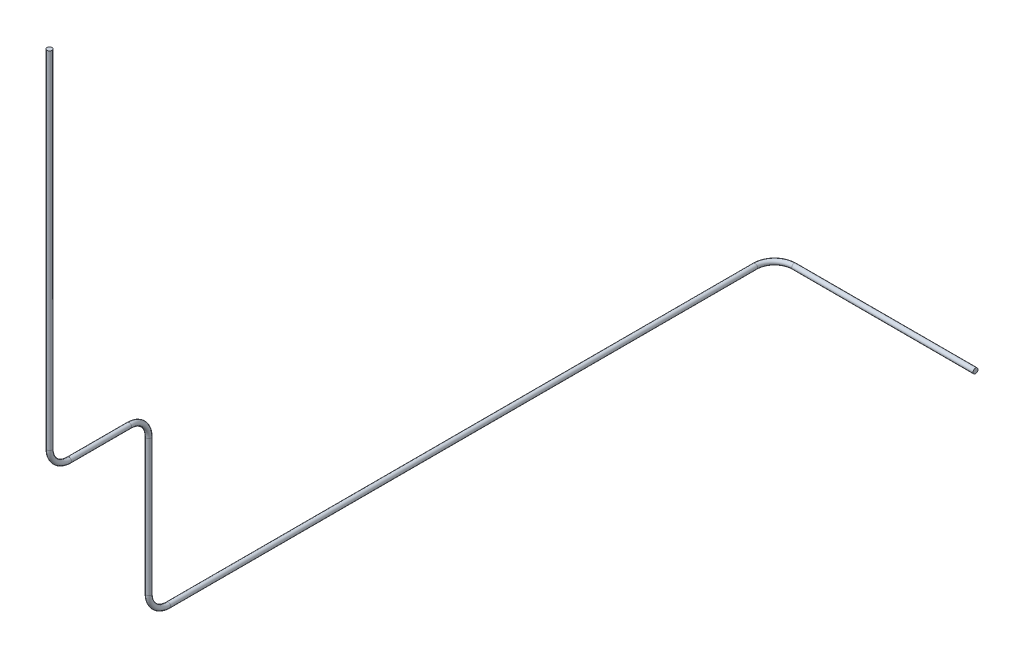
ISO-10303-21;
HEADER;
FILE_DESCRIPTION(('STEP AP214'),'2;1');
FILE_NAME('part.step','',(''),(''),'','','');
FILE_SCHEMA(('AUTOMOTIVE_DESIGN { 1 0 10303 214 1 1 1 1 }'));
ENDSEC;
DATA;
#1=APPLICATION_CONTEXT('core data for automotive mechanical design processes');
#2=APPLICATION_PROTOCOL_DEFINITION('international standard','automotive_design',2000,#1);
#3=PRODUCT_CONTEXT('',#1,'mechanical');
#4=PRODUCT('Part','Part','',(#3));
#5=PRODUCT_RELATED_PRODUCT_CATEGORY('part','',(#4));
#6=PRODUCT_DEFINITION_FORMATION('','',#4);
#7=PRODUCT_DEFINITION_CONTEXT('part definition',#1,'design');
#8=PRODUCT_DEFINITION('design','',#6,#7);
#9=PRODUCT_DEFINITION_SHAPE('','',#8);
#10=(LENGTH_UNIT() NAMED_UNIT(*) SI_UNIT(.MILLI.,.METRE.));
#11=(NAMED_UNIT(*) PLANE_ANGLE_UNIT() SI_UNIT($,.RADIAN.));
#12=(NAMED_UNIT(*) SI_UNIT($,.STERADIAN.) SOLID_ANGLE_UNIT());
#13=UNCERTAINTY_MEASURE_WITH_UNIT(LENGTH_MEASURE(1.E-05),#10,'distance_accuracy_value','');
#14=(GEOMETRIC_REPRESENTATION_CONTEXT(3) GLOBAL_UNCERTAINTY_ASSIGNED_CONTEXT((#13)) GLOBAL_UNIT_ASSIGNED_CONTEXT((#10,
#11,#12)) REPRESENTATION_CONTEXT('',''));
#15=CARTESIAN_POINT('',(0.,0.,0.));
#16=DIRECTION('',(0.,0.,1.));
#17=DIRECTION('',(1.,0.,0.));
#18=AXIS2_PLACEMENT_3D('',#15,#16,#17);
#19=CARTESIAN_POINT('',(-1396.53720192229,-956.747632740087,1867.92));
#20=DIRECTION('',(1.,0.,0.));
#21=DIRECTION('',(0.,1.,0.));
#22=AXIS2_PLACEMENT_3D('',#19,#20,#21);
#23=PLANE('',#22);
#24=CARTESIAN_POINT('',(-1396.53720192229,-956.747632740087,1867.92));
#25=DIRECTION('',(1.,0.,0.));
#26=DIRECTION('',(0.,1.,0.));
#27=AXIS2_PLACEMENT_3D('',#24,#25,#26);
#28=CIRCLE('',#27,6.35000000000008);
#29=CARTESIAN_POINT('',(-1396.53720192229,-950.397632740087,1867.92));
#30=VERTEX_POINT('',#29);
#31=EDGE_CURVE('E56',#30,#30,#28,.T.);
#32=ORIENTED_EDGE('',*,*,#31,.T.);
#33=EDGE_LOOP('',(#32));
#34=FACE_BOUND('',#33,.T.);
#35=ADVANCED_FACE('F44',(#34),#23,.T.);
#36=CARTESIAN_POINT('',(-1909.81428199229,425.180570663524,3720.19045699918));
#37=DIRECTION('',(0.,-1.,0.));
#38=DIRECTION('',(0.,0.,-1.));
#39=AXIS2_PLACEMENT_3D('',#36,#37,#38);
#40=PLANE('',#39);
#41=CARTESIAN_POINT('',(-1909.81428199229,425.180570663524,3720.19045699918));
#42=DIRECTION('',(0.,-1.,0.));
#43=DIRECTION('',(0.,0.,-1.));
#44=AXIS2_PLACEMENT_3D('',#41,#42,#43);
#45=CIRCLE('',#44,6.35000000000008);
#46=CARTESIAN_POINT('',(-1909.81428199229,425.180570663524,3713.84045699918));
#47=VERTEX_POINT('',#46);
#48=EDGE_CURVE('E12',#47,#47,#45,.T.);
#49=ORIENTED_EDGE('',*,*,#48,.F.);
#50=EDGE_LOOP('',(#49));
#51=FACE_BOUND('',#50,.T.);
#52=ADVANCED_FACE('F62',(#51),#40,.F.);
#53=CARTESIAN_POINT('',(-1396.53720192229,-956.747632740087,1867.92));
#54=DIRECTION('',(-1.,0.,0.));
#55=DIRECTION('',(0.,0.,1.));
#56=AXIS2_PLACEMENT_3D('',#53,#54,#55);
#57=CYLINDRICAL_SURFACE('',#56,6.35000000000008);
#58=CARTESIAN_POINT('',(-1859.81428199229,-956.747632740087,1867.92));
#59=DIRECTION('',(1.,0.,0.));
#60=DIRECTION('',(0.,1.,0.));
#61=AXIS2_PLACEMENT_3D('',#58,#59,#60);
#62=CIRCLE('',#61,6.35000000000008);
#63=CARTESIAN_POINT('',(-1859.81428199229,-956.747632740087,1861.57));
#64=VERTEX_POINT('',#63);
#65=EDGE_CURVE('E112',#64,#64,#62,.T.);
#66=ORIENTED_EDGE('',*,*,#65,.T.);
#67=EDGE_LOOP('',(#66));
#68=FACE_BOUND('',#67,.T.);
#69=ORIENTED_EDGE('',*,*,#31,.F.);
#70=EDGE_LOOP('',(#69));
#71=FACE_BOUND('',#70,.T.);
#72=ADVANCED_FACE('F64',(#68,#71),#57,.T.);
#73=CARTESIAN_POINT('',(-1859.81428199229,-956.747632740087,1917.92));
#74=DIRECTION('',(0.,1.,0.));
#75=DIRECTION('',(0.,0.,1.));
#76=AXIS2_PLACEMENT_3D('',#73,#74,#75);
#77=TOROIDAL_SURFACE('',#76,50.0000000000003,6.35000000000008);
#78=CARTESIAN_POINT('',(-1909.81428199229,-956.747632740087,1917.92));
#79=DIRECTION('',(0.,0.,-1.));
#80=DIRECTION('',(0.,1.,0.));
#81=AXIS2_PLACEMENT_3D('',#78,#79,#80);
#82=CIRCLE('',#81,6.35000000000008);
#83=CARTESIAN_POINT('',(-1916.16428199229,-956.747632740087,1917.92));
#84=VERTEX_POINT('',#83);
#85=EDGE_CURVE('E109',#84,#84,#82,.T.);
#86=CARTESIAN_POINT('',(-1859.81428199229,-956.747632740087,1917.92));
#87=DIRECTION('',(0.,1.,0.));
#88=DIRECTION('',(0.,0.,1.));
#89=AXIS2_PLACEMENT_3D('',#86,#87,#88);
#90=CIRCLE('',#89,56.3500000000003);
#91=EDGE_CURVE('',#64,#84,#90,.T.);
#92=ORIENTED_EDGE('',*,*,#65,.F.);
#93=ORIENTED_EDGE('',*,*,#85,.T.);
#94=ORIENTED_EDGE('',*,*,#91,.T.);
#95=ORIENTED_EDGE('',*,*,#91,.F.);
#96=EDGE_LOOP('',(#92,#94,#93,#95));
#97=FACE_BOUND('',#96,.T.);
#98=ADVANCED_FACE('F69',(#97),#77,.T.);
#99=CARTESIAN_POINT('',(-1909.81428199229,-956.747632740087,1917.92));
#100=DIRECTION('',(0.,0.,1.));
#101=DIRECTION('',(0.,-1.,0.));
#102=AXIS2_PLACEMENT_3D('',#99,#100,#101);
#103=CYLINDRICAL_SURFACE('',#102,6.35000000000008);
#104=CARTESIAN_POINT('',(-1909.81428199229,-956.747632740087,3416.97926190202));
#105=DIRECTION('',(0.,0.,-1.));
#106=DIRECTION('',(0.,1.,0.));
#107=AXIS2_PLACEMENT_3D('',#104,#105,#106);
#108=CIRCLE('',#107,6.35000000000008);
#109=CARTESIAN_POINT('',(-1909.81428199229,-963.097632740088,3416.97926190202));
#110=VERTEX_POINT('',#109);
#111=EDGE_CURVE('E114',#110,#110,#108,.T.);
#112=ORIENTED_EDGE('',*,*,#111,.T.);
#113=EDGE_LOOP('',(#112));
#114=FACE_BOUND('',#113,.T.);
#115=ORIENTED_EDGE('',*,*,#85,.F.);
#116=EDGE_LOOP('',(#115));
#117=FACE_BOUND('',#116,.T.);
#118=ADVANCED_FACE('F97',(#114,#117),#103,.T.);
#119=CARTESIAN_POINT('',(-1909.81428199229,-906.747632740088,3416.97926190202));
#120=DIRECTION('',(-1.,0.,0.));
#121=DIRECTION('',(0.,0.,1.));
#122=AXIS2_PLACEMENT_3D('',#119,#120,#121);
#123=TOROIDAL_SURFACE('',#122,49.9999999999999,6.35000000000008);
#124=CARTESIAN_POINT('',(-1909.81428199229,-906.747632740088,3466.97926190202));
#125=DIRECTION('',(0.,-1.,0.));
#126=DIRECTION('',(0.,0.,-1.));
#127=AXIS2_PLACEMENT_3D('',#124,#125,#126);
#128=CIRCLE('',#127,6.35000000000008);
#129=CARTESIAN_POINT('',(-1909.81428199229,-906.747632740088,3473.32926190202));
#130=VERTEX_POINT('',#129);
#131=EDGE_CURVE('E120',#130,#130,#128,.T.);
#132=CARTESIAN_POINT('',(-1909.81428199229,-906.747632740088,3416.97926190202));
#133=DIRECTION('',(-1.,0.,0.));
#134=DIRECTION('',(0.,0.,1.));
#135=AXIS2_PLACEMENT_3D('',#132,#133,#134);
#136=CIRCLE('',#135,56.35);
#137=EDGE_CURVE('',#110,#130,#136,.T.);
#138=ORIENTED_EDGE('',*,*,#111,.F.);
#139=ORIENTED_EDGE('',*,*,#131,.T.);
#140=ORIENTED_EDGE('',*,*,#137,.T.);
#141=ORIENTED_EDGE('',*,*,#137,.F.);
#142=EDGE_LOOP('',(#138,#140,#139,#141));
#143=FACE_BOUND('',#142,.T.);
#144=ADVANCED_FACE('F93',(#143),#123,.T.);
#145=CARTESIAN_POINT('',(-1909.81428199229,-906.747632740088,3466.97926190202));
#146=DIRECTION('',(0.,1.,0.));
#147=DIRECTION('',(0.,0.,1.));
#148=AXIS2_PLACEMENT_3D('',#145,#146,#147);
#149=CYLINDRICAL_SURFACE('',#148,6.35000000000008);
#150=CARTESIAN_POINT('',(-1909.81428199229,-559.253278672728,3466.97926190202));
#151=DIRECTION('',(0.,-1.,0.));
#152=DIRECTION('',(0.,0.,-1.));
#153=AXIS2_PLACEMENT_3D('',#150,#151,#152);
#154=CIRCLE('',#153,6.35000000000008);
#155=CARTESIAN_POINT('',(-1909.81428199229,-559.253278672728,3460.62926190202));
#156=VERTEX_POINT('',#155);
#157=EDGE_CURVE('E123',#156,#156,#154,.T.);
#158=ORIENTED_EDGE('',*,*,#157,.T.);
#159=EDGE_LOOP('',(#158));
#160=FACE_BOUND('',#159,.T.);
#161=ORIENTED_EDGE('',*,*,#131,.F.);
#162=EDGE_LOOP('',(#161));
#163=FACE_BOUND('',#162,.T.);
#164=ADVANCED_FACE('F89',(#160,#163),#149,.T.);
#165=CARTESIAN_POINT('',(-1909.81428199229,-559.253278672728,3516.97926190202));
#166=DIRECTION('',(1.,0.,0.));
#167=DIRECTION('',(0.,0.,-1.));
#168=AXIS2_PLACEMENT_3D('',#165,#166,#167);
#169=TOROIDAL_SURFACE('',#168,49.9999999999998,6.35000000000008);
#170=CARTESIAN_POINT('',(-1909.81428199229,-509.253278672728,3516.97926190202));
#171=DIRECTION('',(0.,0.,-1.));
#172=DIRECTION('',(0.,1.,0.));
#173=AXIS2_PLACEMENT_3D('',#170,#171,#172);
#174=CIRCLE('',#173,6.35000000000008);
#175=CARTESIAN_POINT('',(-1909.81428199229,-502.903278672728,3516.97926190202));
#176=VERTEX_POINT('',#175);
#177=EDGE_CURVE('E126',#176,#176,#174,.T.);
#178=CARTESIAN_POINT('',(-1909.81428199229,-559.253278672728,3516.97926190202));
#179=DIRECTION('',(1.,0.,0.));
#180=DIRECTION('',(0.,0.,-1.));
#181=AXIS2_PLACEMENT_3D('',#178,#179,#180);
#182=CIRCLE('',#181,56.3499999999999);
#183=EDGE_CURVE('',#156,#176,#182,.T.);
#184=ORIENTED_EDGE('',*,*,#157,.F.);
#185=ORIENTED_EDGE('',*,*,#177,.T.);
#186=ORIENTED_EDGE('',*,*,#183,.T.);
#187=ORIENTED_EDGE('',*,*,#183,.F.);
#188=EDGE_LOOP('',(#184,#186,#185,#187));
#189=FACE_BOUND('',#188,.T.);
#190=ADVANCED_FACE('F85',(#189),#169,.T.);
#191=CARTESIAN_POINT('',(-1909.81428199229,-509.253278672728,3516.97926190202));
#192=DIRECTION('',(0.,0.,1.));
#193=DIRECTION('',(1.,0.,0.));
#194=AXIS2_PLACEMENT_3D('',#191,#192,#193);
#195=CYLINDRICAL_SURFACE('',#194,6.35000000000008);
#196=CARTESIAN_POINT('',(-1909.81428199229,-509.253278672728,3670.19045699918));
#197=DIRECTION('',(0.,0.,-1.));
#198=DIRECTION('',(0.,1.,0.));
#199=AXIS2_PLACEMENT_3D('',#196,#197,#198);
#200=CIRCLE('',#199,6.35000000000008);
#201=CARTESIAN_POINT('',(-1909.81428199229,-515.603278672728,3670.19045699918));
#202=VERTEX_POINT('',#201);
#203=EDGE_CURVE('E129',#202,#202,#200,.T.);
#204=ORIENTED_EDGE('',*,*,#203,.T.);
#205=EDGE_LOOP('',(#204));
#206=FACE_BOUND('',#205,.T.);
#207=ORIENTED_EDGE('',*,*,#177,.F.);
#208=EDGE_LOOP('',(#207));
#209=FACE_BOUND('',#208,.T.);
#210=ADVANCED_FACE('F79',(#206,#209),#195,.T.);
#211=CARTESIAN_POINT('',(-1909.81428199229,-459.253278672728,3670.19045699918));
#212=DIRECTION('',(-1.,0.,0.));
#213=DIRECTION('',(0.,0.,1.));
#214=AXIS2_PLACEMENT_3D('',#211,#212,#213);
#215=TOROIDAL_SURFACE('',#214,50.,6.35000000000008);
#216=CARTESIAN_POINT('',(-1909.81428199229,-459.253278672728,3720.19045699918));
#217=DIRECTION('',(0.,-1.,0.));
#218=DIRECTION('',(0.,0.,-1.));
#219=AXIS2_PLACEMENT_3D('',#216,#217,#218);
#220=CIRCLE('',#219,6.35000000000008);
#221=CARTESIAN_POINT('',(-1909.81428199229,-459.253278672728,3726.54045699918));
#222=VERTEX_POINT('',#221);
#223=EDGE_CURVE('E51',#222,#222,#220,.T.);
#224=CARTESIAN_POINT('',(-1909.81428199229,-459.253278672728,3670.19045699918));
#225=DIRECTION('',(-1.,0.,0.));
#226=DIRECTION('',(0.,0.,1.));
#227=AXIS2_PLACEMENT_3D('',#224,#225,#226);
#228=CIRCLE('',#227,56.3500000000001);
#229=EDGE_CURVE('',#202,#222,#228,.T.);
#230=ORIENTED_EDGE('',*,*,#203,.F.);
#231=ORIENTED_EDGE('',*,*,#223,.T.);
#232=ORIENTED_EDGE('',*,*,#229,.T.);
#233=ORIENTED_EDGE('',*,*,#229,.F.);
#234=EDGE_LOOP('',(#230,#232,#231,#233));
#235=FACE_BOUND('',#234,.T.);
#236=ADVANCED_FACE('F75',(#235),#215,.T.);
#237=CARTESIAN_POINT('',(-1909.81428199229,-459.253278672728,3720.19045699918));
#238=DIRECTION('',(0.,1.,0.));
#239=DIRECTION('',(0.,0.,1.));
#240=AXIS2_PLACEMENT_3D('',#237,#238,#239);
#241=CYLINDRICAL_SURFACE('',#240,6.35000000000008);
#242=ORIENTED_EDGE('',*,*,#48,.T.);
#243=EDGE_LOOP('',(#242));
#244=FACE_BOUND('',#243,.T.);
#245=ORIENTED_EDGE('',*,*,#223,.F.);
#246=EDGE_LOOP('',(#245));
#247=FACE_BOUND('',#246,.T.);
#248=ADVANCED_FACE('F59',(#244,#247),#241,.T.);
#249=CLOSED_SHELL('',(#35,#52,#72,#98,#118,#144,#164,#190,#210,#236,#248));
#250=MANIFOLD_SOLID_BREP('B2',#249);
#251=ADVANCED_BREP_SHAPE_REPRESENTATION('',(#18,#250),#14);
#252=SHAPE_DEFINITION_REPRESENTATION(#9,#251);
ENDSEC;
END-ISO-10303-21;
